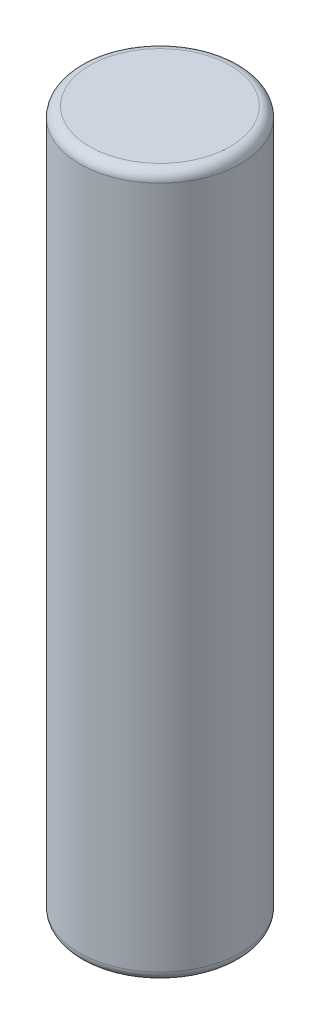
ISO-10303-21;
HEADER;
FILE_DESCRIPTION(('STEP AP214'),'2;1');
FILE_NAME('part.step','',(''),(''),'','','');
FILE_SCHEMA(('AUTOMOTIVE_DESIGN { 1 0 10303 214 1 1 1 1 }'));
ENDSEC;
DATA;
#1=APPLICATION_CONTEXT('core data for automotive mechanical design processes');
#2=APPLICATION_PROTOCOL_DEFINITION('international standard','automotive_design',2000,#1);
#3=PRODUCT_CONTEXT('',#1,'mechanical');
#4=PRODUCT('Part','Part','',(#3));
#5=PRODUCT_RELATED_PRODUCT_CATEGORY('part','',(#4));
#6=PRODUCT_DEFINITION_FORMATION('','',#4);
#7=PRODUCT_DEFINITION_CONTEXT('part definition',#1,'design');
#8=PRODUCT_DEFINITION('design','',#6,#7);
#9=PRODUCT_DEFINITION_SHAPE('','',#8);
#10=(LENGTH_UNIT() NAMED_UNIT(*) SI_UNIT(.MILLI.,.METRE.));
#11=(NAMED_UNIT(*) PLANE_ANGLE_UNIT() SI_UNIT($,.RADIAN.));
#12=(NAMED_UNIT(*) SI_UNIT($,.STERADIAN.) SOLID_ANGLE_UNIT());
#13=UNCERTAINTY_MEASURE_WITH_UNIT(LENGTH_MEASURE(1.E-05),#10,'distance_accuracy_value','');
#14=(GEOMETRIC_REPRESENTATION_CONTEXT(3) GLOBAL_UNCERTAINTY_ASSIGNED_CONTEXT((#13)) GLOBAL_UNIT_ASSIGNED_CONTEXT((#10,
#11,#12)) REPRESENTATION_CONTEXT('',''));
#15=CARTESIAN_POINT('',(0.,0.,0.));
#16=DIRECTION('',(0.,0.,1.));
#17=DIRECTION('',(1.,0.,0.));
#18=AXIS2_PLACEMENT_3D('',#15,#16,#17);
#19=CARTESIAN_POINT('',(0.,7.,0.));
#20=DIRECTION('',(0.,-1.,0.));
#21=DIRECTION('',(0.,0.,-1.));
#22=AXIS2_PLACEMENT_3D('',#19,#20,#21);
#23=CYLINDRICAL_SURFACE('',#22,0.8);
#24=CARTESIAN_POINT('',(0.,0.1,0.));
#25=DIRECTION('',(0.,1.,0.));
#26=DIRECTION('',(0.,0.,1.));
#27=AXIS2_PLACEMENT_3D('',#24,#25,#26);
#28=CIRCLE('',#27,0.8);
#29=CARTESIAN_POINT('',(0.,0.1,0.8));
#30=VERTEX_POINT('',#29);
#31=EDGE_CURVE('E46',#30,#30,#28,.T.);
#32=ORIENTED_EDGE('',*,*,#31,.T.);
#33=EDGE_LOOP('',(#32));
#34=FACE_BOUND('',#33,.T.);
#35=CARTESIAN_POINT('',(0.,6.9,0.));
#36=DIRECTION('',(0.,1.,0.));
#37=DIRECTION('',(0.,0.,1.));
#38=AXIS2_PLACEMENT_3D('',#35,#36,#37);
#39=CIRCLE('',#38,0.8);
#40=CARTESIAN_POINT('',(0.,6.9,0.8));
#41=VERTEX_POINT('',#40);
#42=EDGE_CURVE('E50',#41,#41,#39,.F.);
#43=ORIENTED_EDGE('',*,*,#42,.T.);
#44=EDGE_LOOP('',(#43));
#45=FACE_BOUND('',#44,.T.);
#46=ADVANCED_FACE('F35',(#34,#45),#23,.T.);
#47=CARTESIAN_POINT('',(0.,7.,0.));
#48=DIRECTION('',(0.,1.,0.));
#49=DIRECTION('',(0.,0.,1.));
#50=AXIS2_PLACEMENT_3D('',#47,#48,#49);
#51=PLANE('',#50);
#52=CARTESIAN_POINT('',(0.,7.,0.));
#53=DIRECTION('',(0.,1.,0.));
#54=DIRECTION('',(0.,0.,1.));
#55=AXIS2_PLACEMENT_3D('',#52,#53,#54);
#56=CIRCLE('',#55,0.7);
#57=CARTESIAN_POINT('',(0.,7.,0.7));
#58=VERTEX_POINT('',#57);
#59=EDGE_CURVE('E10',#58,#58,#56,.T.);
#60=ORIENTED_EDGE('',*,*,#59,.T.);
#61=EDGE_LOOP('',(#60));
#62=FACE_BOUND('',#61,.T.);
#63=ADVANCED_FACE('F66',(#62),#51,.T.);
#64=CARTESIAN_POINT('',(0.,0.,0.));
#65=DIRECTION('',(0.,1.,0.));
#66=DIRECTION('',(0.,0.,1.));
#67=AXIS2_PLACEMENT_3D('',#64,#65,#66);
#68=PLANE('',#67);
#69=CARTESIAN_POINT('',(0.,0.,0.));
#70=DIRECTION('',(0.,1.,0.));
#71=DIRECTION('',(0.,0.,1.));
#72=AXIS2_PLACEMENT_3D('',#69,#70,#71);
#73=CIRCLE('',#72,0.7);
#74=CARTESIAN_POINT('',(0.,0.,0.7));
#75=VERTEX_POINT('',#74);
#76=EDGE_CURVE('E42',#75,#75,#73,.F.);
#77=ORIENTED_EDGE('',*,*,#76,.T.);
#78=EDGE_LOOP('',(#77));
#79=FACE_BOUND('',#78,.T.);
#80=ADVANCED_FACE('F63',(#79),#68,.F.);
#81=CARTESIAN_POINT('',(0.,0.1,0.));
#82=DIRECTION('',(0.,1.,0.));
#83=DIRECTION('',(0.,0.,1.));
#84=AXIS2_PLACEMENT_3D('',#81,#82,#83);
#85=TOROIDAL_SURFACE('',#84,0.7,0.1);
#86=ORIENTED_EDGE('',*,*,#76,.F.);
#87=EDGE_LOOP('',(#86));
#88=FACE_BOUND('',#87,.T.);
#89=ORIENTED_EDGE('',*,*,#31,.F.);
#90=EDGE_LOOP('',(#89));
#91=FACE_BOUND('',#90,.T.);
#92=ADVANCED_FACE('F59',(#88,#91),#85,.T.);
#93=CARTESIAN_POINT('',(0.,6.9,0.));
#94=DIRECTION('',(0.,1.,0.));
#95=DIRECTION('',(0.,0.,1.));
#96=AXIS2_PLACEMENT_3D('',#93,#94,#95);
#97=TOROIDAL_SURFACE('',#96,0.7,0.1);
#98=ORIENTED_EDGE('',*,*,#42,.F.);
#99=EDGE_LOOP('',(#98));
#100=FACE_BOUND('',#99,.T.);
#101=ORIENTED_EDGE('',*,*,#59,.F.);
#102=EDGE_LOOP('',(#101));
#103=FACE_BOUND('',#102,.T.);
#104=ADVANCED_FACE('F37',(#100,#103),#97,.T.);
#105=CLOSED_SHELL('',(#46,#63,#80,#92,#104));
#106=MANIFOLD_SOLID_BREP('B2',#105);
#107=ADVANCED_BREP_SHAPE_REPRESENTATION('',(#18,#106),#14);
#108=SHAPE_DEFINITION_REPRESENTATION(#9,#107);
ENDSEC;
END-ISO-10303-21;
